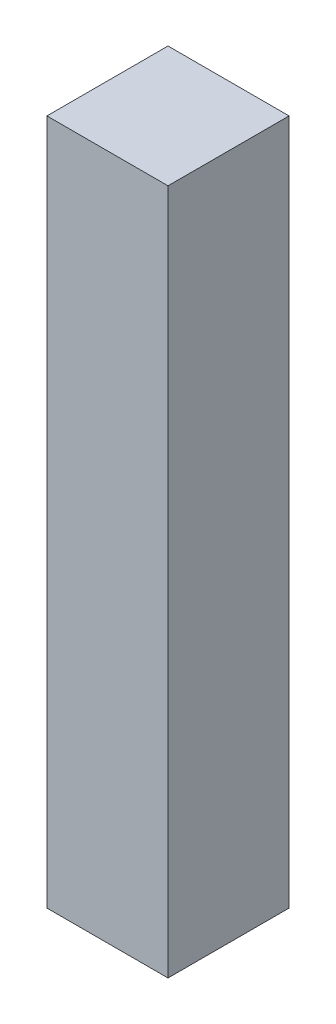
ISO-10303-21;
HEADER;
FILE_DESCRIPTION(('STEP AP214'),'2;1');
FILE_NAME('part.step','',(''),(''),'','','');
FILE_SCHEMA(('AUTOMOTIVE_DESIGN { 1 0 10303 214 1 1 1 1 }'));
ENDSEC;
DATA;
#1=APPLICATION_CONTEXT('core data for automotive mechanical design processes');
#2=APPLICATION_PROTOCOL_DEFINITION('international standard','automotive_design',2000,#1);
#3=PRODUCT_CONTEXT('',#1,'mechanical');
#4=PRODUCT('Part','Part','',(#3));
#5=PRODUCT_RELATED_PRODUCT_CATEGORY('part','',(#4));
#6=PRODUCT_DEFINITION_FORMATION('','',#4);
#7=PRODUCT_DEFINITION_CONTEXT('part definition',#1,'design');
#8=PRODUCT_DEFINITION('design','',#6,#7);
#9=PRODUCT_DEFINITION_SHAPE('','',#8);
#10=(LENGTH_UNIT() NAMED_UNIT(*) SI_UNIT(.MILLI.,.METRE.));
#11=(NAMED_UNIT(*) PLANE_ANGLE_UNIT() SI_UNIT($,.RADIAN.));
#12=(NAMED_UNIT(*) SI_UNIT($,.STERADIAN.) SOLID_ANGLE_UNIT());
#13=UNCERTAINTY_MEASURE_WITH_UNIT(LENGTH_MEASURE(1.E-05),#10,'distance_accuracy_value','');
#14=(GEOMETRIC_REPRESENTATION_CONTEXT(3) GLOBAL_UNCERTAINTY_ASSIGNED_CONTEXT((#13)) GLOBAL_UNIT_ASSIGNED_CONTEXT((#10,
#11,#12)) REPRESENTATION_CONTEXT('',''));
#15=CARTESIAN_POINT('',(0.,0.,0.));
#16=DIRECTION('',(0.,0.,1.));
#17=DIRECTION('',(1.,0.,0.));
#18=AXIS2_PLACEMENT_3D('',#15,#16,#17);
#19=CARTESIAN_POINT('',(-150.,1700.,150.));
#20=DIRECTION('',(1.,0.,0.));
#21=DIRECTION('',(0.,0.,-1.));
#22=AXIS2_PLACEMENT_3D('',#19,#20,#21);
#23=PLANE('',#22);
#24=DIRECTION('',(0.,0.,1.));
#25=VECTOR('',#24,1.);
#26=CARTESIAN_POINT('',(-150.,0.,150.));
#27=LINE('',#26,#25);
#28=CARTESIAN_POINT('',(-150.,0.,-150.));
#29=VERTEX_POINT('',#28);
#30=CARTESIAN_POINT('',(-150.,0.,150.));
#31=VERTEX_POINT('',#30);
#32=EDGE_CURVE('E107',#29,#31,#27,.T.);
#33=ORIENTED_EDGE('',*,*,#32,.T.);
#34=DIRECTION('',(0.,-1.,0.));
#35=VECTOR('',#34,1.);
#36=CARTESIAN_POINT('',(-150.,1700.,150.));
#37=LINE('',#36,#35);
#38=CARTESIAN_POINT('',(-150.,1700.,150.));
#39=VERTEX_POINT('',#38);
#40=EDGE_CURVE('E11',#39,#31,#37,.T.);
#41=ORIENTED_EDGE('',*,*,#40,.F.);
#42=DIRECTION('',(0.,0.,1.));
#43=VECTOR('',#42,1.);
#44=CARTESIAN_POINT('',(-150.,1700.,150.));
#45=LINE('',#44,#43);
#46=CARTESIAN_POINT('',(-150.,1700.,-150.));
#47=VERTEX_POINT('',#46);
#48=EDGE_CURVE('E90',#47,#39,#45,.T.);
#49=ORIENTED_EDGE('',*,*,#48,.F.);
#50=DIRECTION('',(0.,-1.,0.));
#51=VECTOR('',#50,1.);
#52=CARTESIAN_POINT('',(-150.,1700.,-150.));
#53=LINE('',#52,#51);
#54=EDGE_CURVE('E103',#47,#29,#53,.T.);
#55=ORIENTED_EDGE('',*,*,#54,.T.);
#56=EDGE_LOOP('',(#33,#41,#49,#55));
#57=FACE_BOUND('',#56,.T.);
#58=ADVANCED_FACE('F38',(#57),#23,.F.);
#59=CARTESIAN_POINT('',(150.,1700.,150.));
#60=DIRECTION('',(0.,0.,-1.));
#61=DIRECTION('',(-1.,0.,0.));
#62=AXIS2_PLACEMENT_3D('',#59,#60,#61);
#63=PLANE('',#62);
#64=DIRECTION('',(1.,0.,0.));
#65=VECTOR('',#64,1.);
#66=CARTESIAN_POINT('',(150.,0.,150.));
#67=LINE('',#66,#65);
#68=CARTESIAN_POINT('',(150.,0.,150.));
#69=VERTEX_POINT('',#68);
#70=EDGE_CURVE('E95',#31,#69,#67,.T.);
#71=ORIENTED_EDGE('',*,*,#70,.T.);
#72=DIRECTION('',(0.,-1.,0.));
#73=VECTOR('',#72,1.);
#74=CARTESIAN_POINT('',(150.,1700.,150.));
#75=LINE('',#74,#73);
#76=CARTESIAN_POINT('',(150.,1700.,150.));
#77=VERTEX_POINT('',#76);
#78=EDGE_CURVE('E47',#77,#69,#75,.T.);
#79=ORIENTED_EDGE('',*,*,#78,.F.);
#80=DIRECTION('',(1.,0.,0.));
#81=VECTOR('',#80,1.);
#82=CARTESIAN_POINT('',(150.,1700.,150.));
#83=LINE('',#82,#81);
#84=EDGE_CURVE('E85',#39,#77,#83,.T.);
#85=ORIENTED_EDGE('',*,*,#84,.F.);
#86=ORIENTED_EDGE('',*,*,#40,.T.);
#87=EDGE_LOOP('',(#71,#79,#85,#86));
#88=FACE_BOUND('',#87,.T.);
#89=ADVANCED_FACE('F94',(#88),#63,.F.);
#90=CARTESIAN_POINT('',(150.,1700.,150.));
#91=DIRECTION('',(-1.,0.,0.));
#92=DIRECTION('',(0.,0.,1.));
#93=AXIS2_PLACEMENT_3D('',#90,#91,#92);
#94=PLANE('',#93);
#95=DIRECTION('',(0.,0.,-1.));
#96=VECTOR('',#95,1.);
#97=CARTESIAN_POINT('',(150.,0.,150.));
#98=LINE('',#97,#96);
#99=CARTESIAN_POINT('',(150.,0.,-150.));
#100=VERTEX_POINT('',#99);
#101=EDGE_CURVE('E72',#69,#100,#98,.T.);
#102=ORIENTED_EDGE('',*,*,#101,.T.);
#103=DIRECTION('',(0.,-1.,0.));
#104=VECTOR('',#103,1.);
#105=CARTESIAN_POINT('',(150.,1700.,-150.));
#106=LINE('',#105,#104);
#107=CARTESIAN_POINT('',(150.,1700.,-150.));
#108=VERTEX_POINT('',#107);
#109=EDGE_CURVE('E97',#108,#100,#106,.T.);
#110=ORIENTED_EDGE('',*,*,#109,.F.);
#111=DIRECTION('',(0.,0.,-1.));
#112=VECTOR('',#111,1.);
#113=CARTESIAN_POINT('',(150.,1700.,150.));
#114=LINE('',#113,#112);
#115=EDGE_CURVE('E88',#77,#108,#114,.T.);
#116=ORIENTED_EDGE('',*,*,#115,.F.);
#117=ORIENTED_EDGE('',*,*,#78,.T.);
#118=EDGE_LOOP('',(#102,#110,#116,#117));
#119=FACE_BOUND('',#118,.T.);
#120=ADVANCED_FACE('F98',(#119),#94,.F.);
#121=CARTESIAN_POINT('',(150.,1700.,-150.));
#122=DIRECTION('',(0.,0.,1.));
#123=DIRECTION('',(1.,0.,0.));
#124=AXIS2_PLACEMENT_3D('',#121,#122,#123);
#125=PLANE('',#124);
#126=DIRECTION('',(-1.,0.,0.));
#127=VECTOR('',#126,1.);
#128=CARTESIAN_POINT('',(150.,0.,-150.));
#129=LINE('',#128,#127);
#130=EDGE_CURVE('E78',#100,#29,#129,.T.);
#131=ORIENTED_EDGE('',*,*,#130,.T.);
#132=ORIENTED_EDGE('',*,*,#54,.F.);
#133=DIRECTION('',(-1.,0.,0.));
#134=VECTOR('',#133,1.);
#135=CARTESIAN_POINT('',(150.,1700.,-150.));
#136=LINE('',#135,#134);
#137=EDGE_CURVE('E55',#108,#47,#136,.T.);
#138=ORIENTED_EDGE('',*,*,#137,.F.);
#139=ORIENTED_EDGE('',*,*,#109,.T.);
#140=EDGE_LOOP('',(#131,#132,#138,#139));
#141=FACE_BOUND('',#140,.T.);
#142=ADVANCED_FACE('F121',(#141),#125,.F.);
#143=CARTESIAN_POINT('',(0.,1700.,0.));
#144=DIRECTION('',(0.,1.,0.));
#145=DIRECTION('',(0.,0.,1.));
#146=AXIS2_PLACEMENT_3D('',#143,#144,#145);
#147=PLANE('',#146);
#148=ORIENTED_EDGE('',*,*,#48,.T.);
#149=ORIENTED_EDGE('',*,*,#84,.T.);
#150=ORIENTED_EDGE('',*,*,#115,.T.);
#151=ORIENTED_EDGE('',*,*,#137,.T.);
#152=EDGE_LOOP('',(#148,#149,#150,#151));
#153=FACE_BOUND('',#152,.T.);
#154=ADVANCED_FACE('F86',(#153),#147,.T.);
#155=CARTESIAN_POINT('',(0.,0.,0.));
#156=DIRECTION('',(0.,1.,0.));
#157=DIRECTION('',(0.,0.,1.));
#158=AXIS2_PLACEMENT_3D('',#155,#156,#157);
#159=PLANE('',#158);
#160=ORIENTED_EDGE('',*,*,#32,.F.);
#161=ORIENTED_EDGE('',*,*,#130,.F.);
#162=ORIENTED_EDGE('',*,*,#101,.F.);
#163=ORIENTED_EDGE('',*,*,#70,.F.);
#164=EDGE_LOOP('',(#160,#161,#162,#163));
#165=FACE_BOUND('',#164,.T.);
#166=ADVANCED_FACE('F124',(#165),#159,.F.);
#167=CLOSED_SHELL('',(#58,#89,#120,#142,#154,#166));
#168=MANIFOLD_SOLID_BREP('B2',#167);
#169=ADVANCED_BREP_SHAPE_REPRESENTATION('',(#18,#168),#14);
#170=SHAPE_DEFINITION_REPRESENTATION(#9,#169);
ENDSEC;
END-ISO-10303-21;
